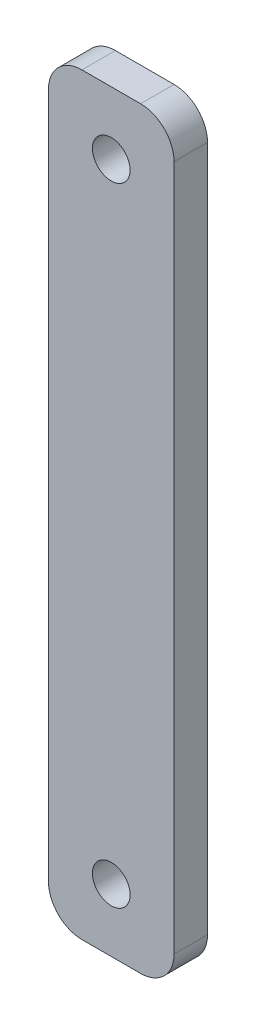
ISO-10303-21;
HEADER;
FILE_DESCRIPTION(('STEP AP214'),'2;1');
FILE_NAME('part.step','',(''),(''),'','','');
FILE_SCHEMA(('AUTOMOTIVE_DESIGN { 1 0 10303 214 1 1 1 1 }'));
ENDSEC;
DATA;
#1=APPLICATION_CONTEXT('core data for automotive mechanical design processes');
#2=APPLICATION_PROTOCOL_DEFINITION('international standard','automotive_design',2000,#1);
#3=PRODUCT_CONTEXT('',#1,'mechanical');
#4=PRODUCT('Part','Part','',(#3));
#5=PRODUCT_RELATED_PRODUCT_CATEGORY('part','',(#4));
#6=PRODUCT_DEFINITION_FORMATION('','',#4);
#7=PRODUCT_DEFINITION_CONTEXT('part definition',#1,'design');
#8=PRODUCT_DEFINITION('design','',#6,#7);
#9=PRODUCT_DEFINITION_SHAPE('','',#8);
#10=(LENGTH_UNIT() NAMED_UNIT(*) SI_UNIT(.MILLI.,.METRE.));
#11=(NAMED_UNIT(*) PLANE_ANGLE_UNIT() SI_UNIT($,.RADIAN.));
#12=(NAMED_UNIT(*) SI_UNIT($,.STERADIAN.) SOLID_ANGLE_UNIT());
#13=UNCERTAINTY_MEASURE_WITH_UNIT(LENGTH_MEASURE(1.E-05),#10,'distance_accuracy_value','');
#14=(GEOMETRIC_REPRESENTATION_CONTEXT(3) GLOBAL_UNCERTAINTY_ASSIGNED_CONTEXT((#13)) GLOBAL_UNIT_ASSIGNED_CONTEXT((#10,
#11,#12)) REPRESENTATION_CONTEXT('',''));
#15=CARTESIAN_POINT('',(0.,0.,0.));
#16=DIRECTION('',(0.,0.,1.));
#17=DIRECTION('',(1.,0.,0.));
#18=AXIS2_PLACEMENT_3D('',#15,#16,#17);
#19=CARTESIAN_POINT('',(-3.49999999999999,-41.,4.));
#20=DIRECTION('',(0.,0.,1.));
#21=DIRECTION('',(1.,0.,0.));
#22=AXIS2_PLACEMENT_3D('',#19,#20,#21);
#23=PLANE('',#22);
#24=CARTESIAN_POINT('',(0.,37.5,4.));
#25=DIRECTION('',(0.,0.,1.));
#26=DIRECTION('',(1.,0.,0.));
#27=AXIS2_PLACEMENT_3D('',#24,#25,#26);
#28=CIRCLE('',#27,2.25);
#29=CARTESIAN_POINT('',(2.25,37.5,4.));
#30=VERTEX_POINT('',#29);
#31=EDGE_CURVE('E150',#30,#30,#28,.T.);
#32=ORIENTED_EDGE('',*,*,#31,.F.);
#33=EDGE_LOOP('',(#32));
#34=FACE_BOUND('',#33,.T.);
#35=CARTESIAN_POINT('',(-3.49999999999999,-41.,4.));
#36=DIRECTION('',(0.,0.,1.));
#37=DIRECTION('',(1.,0.,0.));
#38=AXIS2_PLACEMENT_3D('',#35,#36,#37);
#39=CIRCLE('',#38,4.);
#40=CARTESIAN_POINT('',(-7.49999999999999,-41.,4.));
#41=VERTEX_POINT('',#40);
#42=CARTESIAN_POINT('',(-3.49999999999996,-45.,4.));
#43=VERTEX_POINT('',#42);
#44=EDGE_CURVE('E168',#41,#43,#39,.T.);
#45=ORIENTED_EDGE('',*,*,#44,.T.);
#46=DIRECTION('',(1.,0.,0.));
#47=VECTOR('',#46,1.);
#48=CARTESIAN_POINT('',(-3.49999999999996,-45.,4.));
#49=LINE('',#48,#47);
#50=CARTESIAN_POINT('',(3.49999999999998,-45.,4.));
#51=VERTEX_POINT('',#50);
#52=EDGE_CURVE('E104',#43,#51,#49,.T.);
#53=ORIENTED_EDGE('',*,*,#52,.T.);
#54=CARTESIAN_POINT('',(3.50000000000001,-41.,4.));
#55=DIRECTION('',(0.,0.,1.));
#56=DIRECTION('',(1.,0.,0.));
#57=AXIS2_PLACEMENT_3D('',#54,#55,#56);
#58=CIRCLE('',#57,4.);
#59=CARTESIAN_POINT('',(7.50000000000001,-41.,4.));
#60=VERTEX_POINT('',#59);
#61=EDGE_CURVE('E189',#51,#60,#58,.T.);
#62=ORIENTED_EDGE('',*,*,#61,.T.);
#63=DIRECTION('',(0.,1.,0.));
#64=VECTOR('',#63,1.);
#65=CARTESIAN_POINT('',(7.5,41.,4.));
#66=LINE('',#65,#64);
#67=CARTESIAN_POINT('',(7.5,41.,4.));
#68=VERTEX_POINT('',#67);
#69=EDGE_CURVE('E203',#60,#68,#66,.T.);
#70=ORIENTED_EDGE('',*,*,#69,.T.);
#71=CARTESIAN_POINT('',(3.5,41.,4.));
#72=DIRECTION('',(0.,0.,1.));
#73=DIRECTION('',(-1.,0.,0.));
#74=AXIS2_PLACEMENT_3D('',#71,#72,#73);
#75=CIRCLE('',#74,4.);
#76=CARTESIAN_POINT('',(3.49999999999997,45.,4.));
#77=VERTEX_POINT('',#76);
#78=EDGE_CURVE('E123',#68,#77,#75,.T.);
#79=ORIENTED_EDGE('',*,*,#78,.T.);
#80=DIRECTION('',(-1.,0.,0.));
#81=VECTOR('',#80,1.);
#82=CARTESIAN_POINT('',(-3.49999999999997,45.,4.));
#83=LINE('',#82,#81);
#84=CARTESIAN_POINT('',(-3.49999999999997,45.,4.));
#85=VERTEX_POINT('',#84);
#86=EDGE_CURVE('E117',#77,#85,#83,.T.);
#87=ORIENTED_EDGE('',*,*,#86,.T.);
#88=CARTESIAN_POINT('',(-3.5,41.,4.));
#89=DIRECTION('',(0.,0.,1.));
#90=DIRECTION('',(1.,0.,0.));
#91=AXIS2_PLACEMENT_3D('',#88,#89,#90);
#92=CIRCLE('',#91,4.);
#93=CARTESIAN_POINT('',(-7.5,41.,4.));
#94=VERTEX_POINT('',#93);
#95=EDGE_CURVE('E121',#85,#94,#92,.T.);
#96=ORIENTED_EDGE('',*,*,#95,.T.);
#97=DIRECTION('',(0.,-1.,0.));
#98=VECTOR('',#97,1.);
#99=CARTESIAN_POINT('',(-7.5,41.,4.));
#100=LINE('',#99,#98);
#101=EDGE_CURVE('E61',#94,#41,#100,.T.);
#102=ORIENTED_EDGE('',*,*,#101,.T.);
#103=EDGE_LOOP('',(#45,#53,#62,#70,#79,#87,#96,#102));
#104=FACE_BOUND('',#103,.T.);
#105=CARTESIAN_POINT('',(0.,-37.5,4.));
#106=DIRECTION('',(0.,0.,1.));
#107=DIRECTION('',(-1.,0.,0.));
#108=AXIS2_PLACEMENT_3D('',#105,#106,#107);
#109=CIRCLE('',#108,2.25);
#110=CARTESIAN_POINT('',(-2.25,-37.5,4.));
#111=VERTEX_POINT('',#110);
#112=EDGE_CURVE('E217',#111,#111,#109,.T.);
#113=ORIENTED_EDGE('',*,*,#112,.F.);
#114=EDGE_LOOP('',(#113));
#115=FACE_BOUND('',#114,.T.);
#116=ADVANCED_FACE('F43',(#34,#104,#115),#23,.T.);
#117=CARTESIAN_POINT('',(-3.49999999999999,-41.,0.));
#118=DIRECTION('',(0.,0.,1.));
#119=DIRECTION('',(1.,0.,0.));
#120=AXIS2_PLACEMENT_3D('',#117,#118,#119);
#121=PLANE('',#120);
#122=CARTESIAN_POINT('',(-3.49999999999999,-41.,0.));
#123=DIRECTION('',(0.,0.,1.));
#124=DIRECTION('',(1.,0.,0.));
#125=AXIS2_PLACEMENT_3D('',#122,#123,#124);
#126=CIRCLE('',#125,4.);
#127=CARTESIAN_POINT('',(-7.49999999999999,-41.,0.));
#128=VERTEX_POINT('',#127);
#129=CARTESIAN_POINT('',(-3.49999999999996,-45.,0.));
#130=VERTEX_POINT('',#129);
#131=EDGE_CURVE('E145',#128,#130,#126,.T.);
#132=ORIENTED_EDGE('',*,*,#131,.F.);
#133=DIRECTION('',(0.,-1.,0.));
#134=VECTOR('',#133,1.);
#135=CARTESIAN_POINT('',(-7.5,41.,0.));
#136=LINE('',#135,#134);
#137=CARTESIAN_POINT('',(-7.5,41.,0.));
#138=VERTEX_POINT('',#137);
#139=EDGE_CURVE('E96',#138,#128,#136,.T.);
#140=ORIENTED_EDGE('',*,*,#139,.F.);
#141=CARTESIAN_POINT('',(-3.5,41.,0.));
#142=DIRECTION('',(0.,0.,1.));
#143=DIRECTION('',(1.,0.,0.));
#144=AXIS2_PLACEMENT_3D('',#141,#142,#143);
#145=CIRCLE('',#144,4.);
#146=CARTESIAN_POINT('',(-3.49999999999997,45.,0.));
#147=VERTEX_POINT('',#146);
#148=EDGE_CURVE('E90',#147,#138,#145,.T.);
#149=ORIENTED_EDGE('',*,*,#148,.F.);
#150=DIRECTION('',(-1.,0.,0.));
#151=VECTOR('',#150,1.);
#152=CARTESIAN_POINT('',(-3.49999999999997,45.,0.));
#153=LINE('',#152,#151);
#154=CARTESIAN_POINT('',(3.49999999999997,45.,0.));
#155=VERTEX_POINT('',#154);
#156=EDGE_CURVE('E132',#155,#147,#153,.T.);
#157=ORIENTED_EDGE('',*,*,#156,.F.);
#158=CARTESIAN_POINT('',(3.5,41.,0.));
#159=DIRECTION('',(0.,0.,1.));
#160=DIRECTION('',(-1.,0.,0.));
#161=AXIS2_PLACEMENT_3D('',#158,#159,#160);
#162=CIRCLE('',#161,4.);
#163=CARTESIAN_POINT('',(7.5,41.,0.));
#164=VERTEX_POINT('',#163);
#165=EDGE_CURVE('E159',#164,#155,#162,.T.);
#166=ORIENTED_EDGE('',*,*,#165,.F.);
#167=DIRECTION('',(0.,1.,0.));
#168=VECTOR('',#167,1.);
#169=CARTESIAN_POINT('',(7.5,41.,0.));
#170=LINE('',#169,#168);
#171=CARTESIAN_POINT('',(7.50000000000001,-41.,0.));
#172=VERTEX_POINT('',#171);
#173=EDGE_CURVE('E156',#172,#164,#170,.T.);
#174=ORIENTED_EDGE('',*,*,#173,.F.);
#175=CARTESIAN_POINT('',(3.50000000000001,-41.,0.));
#176=DIRECTION('',(0.,0.,1.));
#177=DIRECTION('',(1.,0.,0.));
#178=AXIS2_PLACEMENT_3D('',#175,#176,#177);
#179=CIRCLE('',#178,4.);
#180=CARTESIAN_POINT('',(3.49999999999998,-45.,0.));
#181=VERTEX_POINT('',#180);
#182=EDGE_CURVE('E153',#181,#172,#179,.T.);
#183=ORIENTED_EDGE('',*,*,#182,.F.);
#184=DIRECTION('',(1.,0.,0.));
#185=VECTOR('',#184,1.);
#186=CARTESIAN_POINT('',(-3.49999999999996,-45.,0.));
#187=LINE('',#186,#185);
#188=EDGE_CURVE('E149',#130,#181,#187,.T.);
#189=ORIENTED_EDGE('',*,*,#188,.F.);
#190=EDGE_LOOP('',(#132,#140,#149,#157,#166,#174,#183,#189));
#191=FACE_BOUND('',#190,.T.);
#192=CARTESIAN_POINT('',(0.,37.5,0.));
#193=DIRECTION('',(0.,0.,1.));
#194=DIRECTION('',(1.,0.,0.));
#195=AXIS2_PLACEMENT_3D('',#192,#193,#194);
#196=CIRCLE('',#195,2.25);
#197=CARTESIAN_POINT('',(2.25,37.5,0.));
#198=VERTEX_POINT('',#197);
#199=EDGE_CURVE('E213',#198,#198,#196,.T.);
#200=ORIENTED_EDGE('',*,*,#199,.T.);
#201=EDGE_LOOP('',(#200));
#202=FACE_BOUND('',#201,.T.);
#203=CARTESIAN_POINT('',(0.,-37.5,0.));
#204=DIRECTION('',(0.,0.,1.));
#205=DIRECTION('',(-1.,0.,0.));
#206=AXIS2_PLACEMENT_3D('',#203,#204,#205);
#207=CIRCLE('',#206,2.25);
#208=CARTESIAN_POINT('',(-2.25,-37.5,0.));
#209=VERTEX_POINT('',#208);
#210=EDGE_CURVE('E221',#209,#209,#207,.T.);
#211=ORIENTED_EDGE('',*,*,#210,.T.);
#212=EDGE_LOOP('',(#211));
#213=FACE_BOUND('',#212,.T.);
#214=ADVANCED_FACE('F193',(#191,#202,#213),#121,.F.);
#215=CARTESIAN_POINT('',(-3.49999999999999,-41.,4.));
#216=DIRECTION('',(0.,0.,-1.));
#217=DIRECTION('',(-1.,0.,0.));
#218=AXIS2_PLACEMENT_3D('',#215,#216,#217);
#219=CYLINDRICAL_SURFACE('',#218,4.);
#220=ORIENTED_EDGE('',*,*,#131,.T.);
#221=DIRECTION('',(0.,0.,-1.));
#222=VECTOR('',#221,1.);
#223=CARTESIAN_POINT('',(-3.49999999999996,-45.,4.));
#224=LINE('',#223,#222);
#225=EDGE_CURVE('E11',#43,#130,#224,.T.);
#226=ORIENTED_EDGE('',*,*,#225,.F.);
#227=ORIENTED_EDGE('',*,*,#44,.F.);
#228=DIRECTION('',(0.,0.,-1.));
#229=VECTOR('',#228,1.);
#230=CARTESIAN_POINT('',(-7.49999999999999,-41.,4.));
#231=LINE('',#230,#229);
#232=EDGE_CURVE('E141',#41,#128,#231,.T.);
#233=ORIENTED_EDGE('',*,*,#232,.T.);
#234=EDGE_LOOP('',(#220,#226,#227,#233));
#235=FACE_BOUND('',#234,.T.);
#236=ADVANCED_FACE('F45',(#235),#219,.T.);
#237=CARTESIAN_POINT('',(-3.49999999999996,-45.,4.));
#238=DIRECTION('',(0.,1.,0.));
#239=DIRECTION('',(0.,0.,1.));
#240=AXIS2_PLACEMENT_3D('',#237,#238,#239);
#241=PLANE('',#240);
#242=ORIENTED_EDGE('',*,*,#188,.T.);
#243=DIRECTION('',(0.,0.,-1.));
#244=VECTOR('',#243,1.);
#245=CARTESIAN_POINT('',(3.49999999999998,-45.,4.));
#246=LINE('',#245,#244);
#247=EDGE_CURVE('E53',#51,#181,#246,.T.);
#248=ORIENTED_EDGE('',*,*,#247,.F.);
#249=ORIENTED_EDGE('',*,*,#52,.F.);
#250=ORIENTED_EDGE('',*,*,#225,.T.);
#251=EDGE_LOOP('',(#242,#248,#249,#250));
#252=FACE_BOUND('',#251,.T.);
#253=ADVANCED_FACE('F255',(#252),#241,.F.);
#254=CARTESIAN_POINT('',(3.50000000000001,-41.,4.));
#255=DIRECTION('',(0.,0.,-1.));
#256=DIRECTION('',(-1.,0.,0.));
#257=AXIS2_PLACEMENT_3D('',#254,#255,#256);
#258=CYLINDRICAL_SURFACE('',#257,4.);
#259=ORIENTED_EDGE('',*,*,#182,.T.);
#260=DIRECTION('',(0.,0.,-1.));
#261=VECTOR('',#260,1.);
#262=CARTESIAN_POINT('',(7.50000000000001,-41.,4.));
#263=LINE('',#262,#261);
#264=EDGE_CURVE('E179',#60,#172,#263,.T.);
#265=ORIENTED_EDGE('',*,*,#264,.F.);
#266=ORIENTED_EDGE('',*,*,#61,.F.);
#267=ORIENTED_EDGE('',*,*,#247,.T.);
#268=EDGE_LOOP('',(#259,#265,#266,#267));
#269=FACE_BOUND('',#268,.T.);
#270=ADVANCED_FACE('F187',(#269),#258,.T.);
#271=CARTESIAN_POINT('',(7.5,41.,4.));
#272=DIRECTION('',(-1.,0.,0.));
#273=DIRECTION('',(0.,-1.,0.));
#274=AXIS2_PLACEMENT_3D('',#271,#272,#273);
#275=PLANE('',#274);
#276=ORIENTED_EDGE('',*,*,#173,.T.);
#277=DIRECTION('',(0.,0.,-1.));
#278=VECTOR('',#277,1.);
#279=CARTESIAN_POINT('',(7.5,41.,4.));
#280=LINE('',#279,#278);
#281=EDGE_CURVE('E175',#68,#164,#280,.T.);
#282=ORIENTED_EDGE('',*,*,#281,.F.);
#283=ORIENTED_EDGE('',*,*,#69,.F.);
#284=ORIENTED_EDGE('',*,*,#264,.T.);
#285=EDGE_LOOP('',(#276,#282,#283,#284));
#286=FACE_BOUND('',#285,.T.);
#287=ADVANCED_FACE('F198',(#286),#275,.F.);
#288=CARTESIAN_POINT('',(3.5,41.,4.));
#289=DIRECTION('',(0.,0.,-1.));
#290=DIRECTION('',(-1.,0.,0.));
#291=AXIS2_PLACEMENT_3D('',#288,#289,#290);
#292=CYLINDRICAL_SURFACE('',#291,4.);
#293=ORIENTED_EDGE('',*,*,#165,.T.);
#294=DIRECTION('',(0.,0.,-1.));
#295=VECTOR('',#294,1.);
#296=CARTESIAN_POINT('',(3.49999999999997,45.,4.));
#297=LINE('',#296,#295);
#298=EDGE_CURVE('E134',#77,#155,#297,.T.);
#299=ORIENTED_EDGE('',*,*,#298,.F.);
#300=ORIENTED_EDGE('',*,*,#78,.F.);
#301=ORIENTED_EDGE('',*,*,#281,.T.);
#302=EDGE_LOOP('',(#293,#299,#300,#301));
#303=FACE_BOUND('',#302,.T.);
#304=ADVANCED_FACE('F201',(#303),#292,.T.);
#305=CARTESIAN_POINT('',(-3.49999999999997,45.,4.));
#306=DIRECTION('',(0.,-1.,0.));
#307=DIRECTION('',(0.,0.,-1.));
#308=AXIS2_PLACEMENT_3D('',#305,#306,#307);
#309=PLANE('',#308);
#310=ORIENTED_EDGE('',*,*,#156,.T.);
#311=DIRECTION('',(0.,0.,-1.));
#312=VECTOR('',#311,1.);
#313=CARTESIAN_POINT('',(-3.49999999999997,45.,4.));
#314=LINE('',#313,#312);
#315=EDGE_CURVE('E129',#85,#147,#314,.T.);
#316=ORIENTED_EDGE('',*,*,#315,.F.);
#317=ORIENTED_EDGE('',*,*,#86,.F.);
#318=ORIENTED_EDGE('',*,*,#298,.T.);
#319=EDGE_LOOP('',(#310,#316,#317,#318));
#320=FACE_BOUND('',#319,.T.);
#321=ADVANCED_FACE('F130',(#320),#309,.F.);
#322=CARTESIAN_POINT('',(-3.5,41.,4.));
#323=DIRECTION('',(0.,0.,-1.));
#324=DIRECTION('',(-1.,0.,0.));
#325=AXIS2_PLACEMENT_3D('',#322,#323,#324);
#326=CYLINDRICAL_SURFACE('',#325,4.);
#327=ORIENTED_EDGE('',*,*,#148,.T.);
#328=DIRECTION('',(0.,0.,-1.));
#329=VECTOR('',#328,1.);
#330=CARTESIAN_POINT('',(-7.5,41.,4.));
#331=LINE('',#330,#329);
#332=EDGE_CURVE('E135',#94,#138,#331,.T.);
#333=ORIENTED_EDGE('',*,*,#332,.F.);
#334=ORIENTED_EDGE('',*,*,#95,.F.);
#335=ORIENTED_EDGE('',*,*,#315,.T.);
#336=EDGE_LOOP('',(#327,#333,#334,#335));
#337=FACE_BOUND('',#336,.T.);
#338=ADVANCED_FACE('F137',(#337),#326,.T.);
#339=CARTESIAN_POINT('',(-7.5,41.,4.));
#340=DIRECTION('',(1.,0.,0.));
#341=DIRECTION('',(0.,1.,0.));
#342=AXIS2_PLACEMENT_3D('',#339,#340,#341);
#343=PLANE('',#342);
#344=ORIENTED_EDGE('',*,*,#139,.T.);
#345=ORIENTED_EDGE('',*,*,#232,.F.);
#346=ORIENTED_EDGE('',*,*,#101,.F.);
#347=ORIENTED_EDGE('',*,*,#332,.T.);
#348=EDGE_LOOP('',(#344,#345,#346,#347));
#349=FACE_BOUND('',#348,.T.);
#350=ADVANCED_FACE('F243',(#349),#343,.F.);
#351=CARTESIAN_POINT('',(0.,37.5,4.));
#352=DIRECTION('',(0.,0.,-1.));
#353=DIRECTION('',(-1.,0.,0.));
#354=AXIS2_PLACEMENT_3D('',#351,#352,#353);
#355=CYLINDRICAL_SURFACE('',#354,2.25);
#356=ORIENTED_EDGE('',*,*,#31,.T.);
#357=EDGE_LOOP('',(#356));
#358=FACE_BOUND('',#357,.T.);
#359=ORIENTED_EDGE('',*,*,#199,.F.);
#360=EDGE_LOOP('',(#359));
#361=FACE_BOUND('',#360,.T.);
#362=ADVANCED_FACE('F240',(#358,#361),#355,.F.);
#363=CARTESIAN_POINT('',(0.,-37.5,4.));
#364=DIRECTION('',(0.,0.,-1.));
#365=DIRECTION('',(-1.,0.,0.));
#366=AXIS2_PLACEMENT_3D('',#363,#364,#365);
#367=CYLINDRICAL_SURFACE('',#366,2.25);
#368=ORIENTED_EDGE('',*,*,#112,.T.);
#369=EDGE_LOOP('',(#368));
#370=FACE_BOUND('',#369,.T.);
#371=ORIENTED_EDGE('',*,*,#210,.F.);
#372=EDGE_LOOP('',(#371));
#373=FACE_BOUND('',#372,.T.);
#374=ADVANCED_FACE('F229',(#370,#373),#367,.F.);
#375=CLOSED_SHELL('',(#116,#214,#236,#253,#270,#287,#304,#321,#338,#350,#362,#374));
#376=MANIFOLD_SOLID_BREP('B2',#375);
#377=ADVANCED_BREP_SHAPE_REPRESENTATION('',(#18,#376),#14);
#378=SHAPE_DEFINITION_REPRESENTATION(#9,#377);
ENDSEC;
END-ISO-10303-21;
